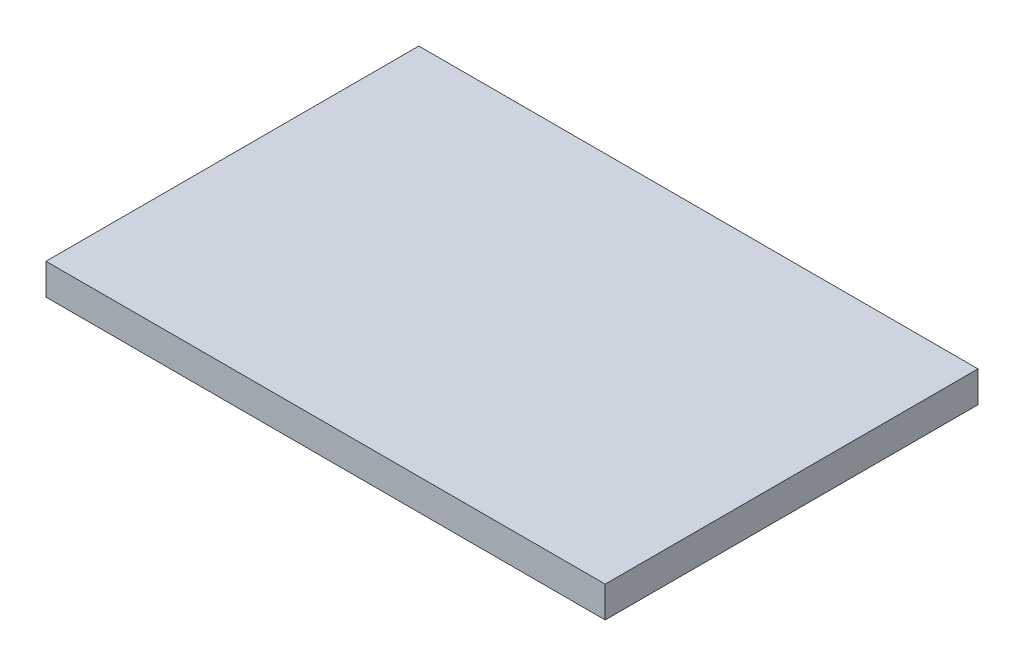
ISO-10303-21;
HEADER;
FILE_DESCRIPTION(('STEP AP214'),'2;1');
FILE_NAME('part.step','',(''),(''),'','','');
FILE_SCHEMA(('AUTOMOTIVE_DESIGN { 1 0 10303 214 1 1 1 1 }'));
ENDSEC;
DATA;
#1=APPLICATION_CONTEXT('core data for automotive mechanical design processes');
#2=APPLICATION_PROTOCOL_DEFINITION('international standard','automotive_design',2000,#1);
#3=PRODUCT_CONTEXT('',#1,'mechanical');
#4=PRODUCT('Part','Part','',(#3));
#5=PRODUCT_RELATED_PRODUCT_CATEGORY('part','',(#4));
#6=PRODUCT_DEFINITION_FORMATION('','',#4);
#7=PRODUCT_DEFINITION_CONTEXT('part definition',#1,'design');
#8=PRODUCT_DEFINITION('design','',#6,#7);
#9=PRODUCT_DEFINITION_SHAPE('','',#8);
#10=(LENGTH_UNIT() NAMED_UNIT(*) SI_UNIT(.MILLI.,.METRE.));
#11=(NAMED_UNIT(*) PLANE_ANGLE_UNIT() SI_UNIT($,.RADIAN.));
#12=(NAMED_UNIT(*) SI_UNIT($,.STERADIAN.) SOLID_ANGLE_UNIT());
#13=UNCERTAINTY_MEASURE_WITH_UNIT(LENGTH_MEASURE(1.E-05),#10,'distance_accuracy_value','');
#14=(GEOMETRIC_REPRESENTATION_CONTEXT(3) GLOBAL_UNCERTAINTY_ASSIGNED_CONTEXT((#13)) GLOBAL_UNIT_ASSIGNED_CONTEXT((#10,
#11,#12)) REPRESENTATION_CONTEXT('',''));
#15=CARTESIAN_POINT('',(0.,0.,0.));
#16=DIRECTION('',(0.,0.,1.));
#17=DIRECTION('',(1.,0.,0.));
#18=AXIS2_PLACEMENT_3D('',#15,#16,#17);
#19=CARTESIAN_POINT('',(228.6,25.4,152.4));
#20=DIRECTION('',(-1.,0.,0.));
#21=DIRECTION('',(0.,0.,1.));
#22=AXIS2_PLACEMENT_3D('',#19,#20,#21);
#23=PLANE('',#22);
#24=DIRECTION('',(0.,0.,-1.));
#25=VECTOR('',#24,1.);
#26=CARTESIAN_POINT('',(228.6,0.,152.4));
#27=LINE('',#26,#25);
#28=CARTESIAN_POINT('',(228.6,0.,152.4));
#29=VERTEX_POINT('',#28);
#30=CARTESIAN_POINT('',(228.6,0.,-152.4));
#31=VERTEX_POINT('',#30);
#32=EDGE_CURVE('E96',#29,#31,#27,.T.);
#33=ORIENTED_EDGE('',*,*,#32,.T.);
#34=DIRECTION('',(0.,-1.,0.));
#35=VECTOR('',#34,1.);
#36=CARTESIAN_POINT('',(228.6,25.4,-152.4));
#37=LINE('',#36,#35);
#38=CARTESIAN_POINT('',(228.6,25.4,-152.4));
#39=VERTEX_POINT('',#38);
#40=EDGE_CURVE('E11',#39,#31,#37,.T.);
#41=ORIENTED_EDGE('',*,*,#40,.F.);
#42=DIRECTION('',(0.,0.,-1.));
#43=VECTOR('',#42,1.);
#44=CARTESIAN_POINT('',(228.6,25.4,152.4));
#45=LINE('',#44,#43);
#46=CARTESIAN_POINT('',(228.6,25.4,152.4));
#47=VERTEX_POINT('',#46);
#48=EDGE_CURVE('E84',#47,#39,#45,.T.);
#49=ORIENTED_EDGE('',*,*,#48,.F.);
#50=DIRECTION('',(0.,-1.,0.));
#51=VECTOR('',#50,1.);
#52=CARTESIAN_POINT('',(228.6,25.4,152.4));
#53=LINE('',#52,#51);
#54=EDGE_CURVE('E92',#47,#29,#53,.T.);
#55=ORIENTED_EDGE('',*,*,#54,.T.);
#56=EDGE_LOOP('',(#33,#41,#49,#55));
#57=FACE_BOUND('',#56,.T.);
#58=ADVANCED_FACE('F33',(#57),#23,.F.);
#59=CARTESIAN_POINT('',(-228.6,25.4,-152.4));
#60=DIRECTION('',(0.,0.,1.));
#61=DIRECTION('',(1.,0.,0.));
#62=AXIS2_PLACEMENT_3D('',#59,#60,#61);
#63=PLANE('',#62);
#64=DIRECTION('',(-1.,0.,0.));
#65=VECTOR('',#64,1.);
#66=CARTESIAN_POINT('',(-228.6,0.,-152.4));
#67=LINE('',#66,#65);
#68=CARTESIAN_POINT('',(-228.6,0.,-152.4));
#69=VERTEX_POINT('',#68);
#70=EDGE_CURVE('E88',#31,#69,#67,.T.);
#71=ORIENTED_EDGE('',*,*,#70,.T.);
#72=DIRECTION('',(0.,-1.,0.));
#73=VECTOR('',#72,1.);
#74=CARTESIAN_POINT('',(-228.6,25.4,-152.4));
#75=LINE('',#74,#73);
#76=CARTESIAN_POINT('',(-228.6,25.4,-152.4));
#77=VERTEX_POINT('',#76);
#78=EDGE_CURVE('E41',#77,#69,#75,.T.);
#79=ORIENTED_EDGE('',*,*,#78,.F.);
#80=DIRECTION('',(-1.,0.,0.));
#81=VECTOR('',#80,1.);
#82=CARTESIAN_POINT('',(-228.6,25.4,-152.4));
#83=LINE('',#82,#81);
#84=EDGE_CURVE('E79',#39,#77,#83,.T.);
#85=ORIENTED_EDGE('',*,*,#84,.F.);
#86=ORIENTED_EDGE('',*,*,#40,.T.);
#87=EDGE_LOOP('',(#71,#79,#85,#86));
#88=FACE_BOUND('',#87,.T.);
#89=ADVANCED_FACE('F87',(#88),#63,.F.);
#90=CARTESIAN_POINT('',(-228.6,25.4,152.4));
#91=DIRECTION('',(1.,0.,0.));
#92=DIRECTION('',(0.,0.,-1.));
#93=AXIS2_PLACEMENT_3D('',#90,#91,#92);
#94=PLANE('',#93);
#95=DIRECTION('',(0.,0.,1.));
#96=VECTOR('',#95,1.);
#97=CARTESIAN_POINT('',(-228.6,0.,152.4));
#98=LINE('',#97,#96);
#99=CARTESIAN_POINT('',(-228.6,0.,152.4));
#100=VERTEX_POINT('',#99);
#101=EDGE_CURVE('E66',#69,#100,#98,.T.);
#102=ORIENTED_EDGE('',*,*,#101,.T.);
#103=DIRECTION('',(0.,-1.,0.));
#104=VECTOR('',#103,1.);
#105=CARTESIAN_POINT('',(-228.6,25.4,152.4));
#106=LINE('',#105,#104);
#107=CARTESIAN_POINT('',(-228.6,25.4,152.4));
#108=VERTEX_POINT('',#107);
#109=EDGE_CURVE('E89',#108,#100,#106,.T.);
#110=ORIENTED_EDGE('',*,*,#109,.F.);
#111=DIRECTION('',(0.,0.,1.));
#112=VECTOR('',#111,1.);
#113=CARTESIAN_POINT('',(-228.6,25.4,152.4));
#114=LINE('',#113,#112);
#115=EDGE_CURVE('E82',#77,#108,#114,.T.);
#116=ORIENTED_EDGE('',*,*,#115,.F.);
#117=ORIENTED_EDGE('',*,*,#78,.T.);
#118=EDGE_LOOP('',(#102,#110,#116,#117));
#119=FACE_BOUND('',#118,.T.);
#120=ADVANCED_FACE('F90',(#119),#94,.F.);
#121=CARTESIAN_POINT('',(-228.6,25.4,152.4));
#122=DIRECTION('',(0.,0.,-1.));
#123=DIRECTION('',(-1.,0.,0.));
#124=AXIS2_PLACEMENT_3D('',#121,#122,#123);
#125=PLANE('',#124);
#126=DIRECTION('',(1.,0.,0.));
#127=VECTOR('',#126,1.);
#128=CARTESIAN_POINT('',(-228.6,0.,152.4));
#129=LINE('',#128,#127);
#130=EDGE_CURVE('E72',#100,#29,#129,.T.);
#131=ORIENTED_EDGE('',*,*,#130,.T.);
#132=ORIENTED_EDGE('',*,*,#54,.F.);
#133=DIRECTION('',(1.,0.,0.));
#134=VECTOR('',#133,1.);
#135=CARTESIAN_POINT('',(-228.6,25.4,152.4));
#136=LINE('',#135,#134);
#137=EDGE_CURVE('E49',#108,#47,#136,.T.);
#138=ORIENTED_EDGE('',*,*,#137,.F.);
#139=ORIENTED_EDGE('',*,*,#109,.T.);
#140=EDGE_LOOP('',(#131,#132,#138,#139));
#141=FACE_BOUND('',#140,.T.);
#142=ADVANCED_FACE('F103',(#141),#125,.F.);
#143=CARTESIAN_POINT('',(0.,25.4,0.));
#144=DIRECTION('',(0.,-1.,0.));
#145=DIRECTION('',(0.,0.,-1.));
#146=AXIS2_PLACEMENT_3D('',#143,#144,#145);
#147=PLANE('',#146);
#148=ORIENTED_EDGE('',*,*,#48,.T.);
#149=ORIENTED_EDGE('',*,*,#84,.T.);
#150=ORIENTED_EDGE('',*,*,#115,.T.);
#151=ORIENTED_EDGE('',*,*,#137,.T.);
#152=EDGE_LOOP('',(#148,#149,#150,#151));
#153=FACE_BOUND('',#152,.T.);
#154=ADVANCED_FACE('F80',(#153),#147,.F.);
#155=CARTESIAN_POINT('',(0.,0.,0.));
#156=DIRECTION('',(0.,-1.,0.));
#157=DIRECTION('',(0.,0.,-1.));
#158=AXIS2_PLACEMENT_3D('',#155,#156,#157);
#159=PLANE('',#158);
#160=ORIENTED_EDGE('',*,*,#32,.F.);
#161=ORIENTED_EDGE('',*,*,#130,.F.);
#162=ORIENTED_EDGE('',*,*,#101,.F.);
#163=ORIENTED_EDGE('',*,*,#70,.F.);
#164=EDGE_LOOP('',(#160,#161,#162,#163));
#165=FACE_BOUND('',#164,.T.);
#166=ADVANCED_FACE('F106',(#165),#159,.T.);
#167=CLOSED_SHELL('',(#58,#89,#120,#142,#154,#166));
#168=MANIFOLD_SOLID_BREP('B2',#167);
#169=ADVANCED_BREP_SHAPE_REPRESENTATION('',(#18,#168),#14);
#170=SHAPE_DEFINITION_REPRESENTATION(#9,#169);
ENDSEC;
END-ISO-10303-21;
